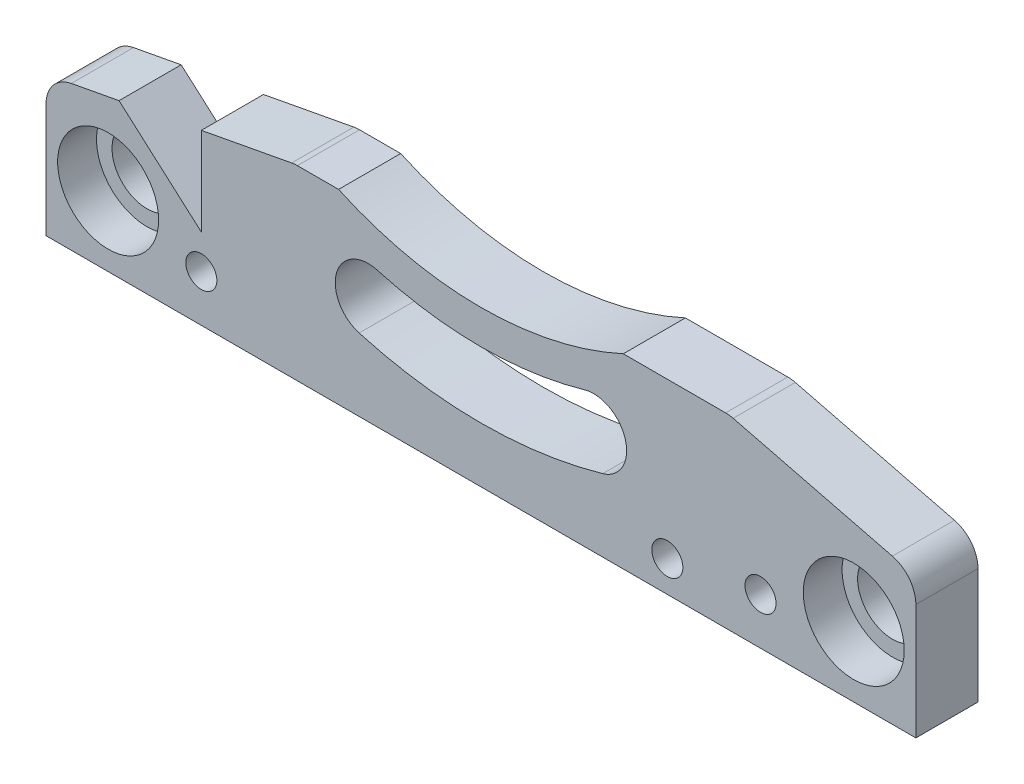
ISO-10303-21;
HEADER;
FILE_DESCRIPTION(('STEP AP214'),'2;1');
FILE_NAME('part.step','',(''),(''),'','','');
FILE_SCHEMA(('AUTOMOTIVE_DESIGN { 1 0 10303 214 1 1 1 1 }'));
ENDSEC;
DATA;
#1=APPLICATION_CONTEXT('core data for automotive mechanical design processes');
#2=APPLICATION_PROTOCOL_DEFINITION('international standard','automotive_design',2000,#1);
#3=PRODUCT_CONTEXT('',#1,'mechanical');
#4=PRODUCT('Part','Part','',(#3));
#5=PRODUCT_RELATED_PRODUCT_CATEGORY('part','',(#4));
#6=PRODUCT_DEFINITION_FORMATION('','',#4);
#7=PRODUCT_DEFINITION_CONTEXT('part definition',#1,'design');
#8=PRODUCT_DEFINITION('design','',#6,#7);
#9=PRODUCT_DEFINITION_SHAPE('','',#8);
#10=(LENGTH_UNIT() NAMED_UNIT(*) SI_UNIT(.MILLI.,.METRE.));
#11=(NAMED_UNIT(*) PLANE_ANGLE_UNIT() SI_UNIT($,.RADIAN.));
#12=(NAMED_UNIT(*) SI_UNIT($,.STERADIAN.) SOLID_ANGLE_UNIT());
#13=UNCERTAINTY_MEASURE_WITH_UNIT(LENGTH_MEASURE(1.E-05),#10,'distance_accuracy_value','');
#14=(GEOMETRIC_REPRESENTATION_CONTEXT(3) GLOBAL_UNCERTAINTY_ASSIGNED_CONTEXT((#13)) GLOBAL_UNIT_ASSIGNED_CONTEXT((#10,
#11,#12)) REPRESENTATION_CONTEXT('',''));
#15=CARTESIAN_POINT('',(0.,0.,0.));
#16=DIRECTION('',(0.,0.,1.));
#17=DIRECTION('',(1.,0.,0.));
#18=AXIS2_PLACEMENT_3D('',#15,#16,#17);
#19=CARTESIAN_POINT('',(-44.45,19.05,0.));
#20=DIRECTION('',(0.,0.,1.));
#21=DIRECTION('',(1.,0.,0.));
#22=AXIS2_PLACEMENT_3D('',#19,#20,#21);
#23=PLANE('',#22);
#24=CARTESIAN_POINT('',(-28.575,4.7625,0.));
#25=DIRECTION('',(0.,0.,1.));
#26=DIRECTION('',(1.,0.,0.));
#27=AXIS2_PLACEMENT_3D('',#24,#25,#26);
#28=CIRCLE('',#27,1.5875);
#29=CARTESIAN_POINT('',(-26.9875,4.7625,0.));
#30=VERTEX_POINT('',#29);
#31=EDGE_CURVE('E574',#30,#30,#28,.T.);
#32=ORIENTED_EDGE('',*,*,#31,.T.);
#33=EDGE_LOOP('',(#32));
#34=FACE_BOUND('',#33,.T.);
#35=CARTESIAN_POINT('',(19.05,3.17500000000001,0.));
#36=DIRECTION('',(0.,0.,1.));
#37=DIRECTION('',(1.,0.,0.));
#38=AXIS2_PLACEMENT_3D('',#35,#36,#37);
#39=CIRCLE('',#38,1.5875);
#40=CARTESIAN_POINT('',(20.6375,3.17500000000001,0.));
#41=VERTEX_POINT('',#40);
#42=EDGE_CURVE('E581',#41,#41,#39,.T.);
#43=ORIENTED_EDGE('',*,*,#42,.T.);
#44=EDGE_LOOP('',(#43));
#45=FACE_BOUND('',#44,.T.);
#46=CARTESIAN_POINT('',(28.575,4.7625,0.));
#47=DIRECTION('',(0.,0.,1.));
#48=DIRECTION('',(1.,0.,0.));
#49=AXIS2_PLACEMENT_3D('',#46,#47,#48);
#50=CIRCLE('',#49,1.5875);
#51=CARTESIAN_POINT('',(30.1625,4.7625,0.));
#52=VERTEX_POINT('',#51);
#53=EDGE_CURVE('E588',#52,#52,#50,.T.);
#54=ORIENTED_EDGE('',*,*,#53,.T.);
#55=EDGE_LOOP('',(#54));
#56=FACE_BOUND('',#55,.T.);
#57=CARTESIAN_POINT('',(-38.1,7.14375,0.));
#58=DIRECTION('',(0.,0.,1.));
#59=DIRECTION('',(1.,0.,0.));
#60=AXIS2_PLACEMENT_3D('',#57,#58,#59);
#61=CIRCLE('',#60,3.57187500000001);
#62=CARTESIAN_POINT('',(-34.528125,7.14375,0.));
#63=VERTEX_POINT('',#62);
#64=EDGE_CURVE('E602',#63,#63,#61,.T.);
#65=ORIENTED_EDGE('',*,*,#64,.T.);
#66=EDGE_LOOP('',(#65));
#67=FACE_BOUND('',#66,.T.);
#68=CARTESIAN_POINT('',(-11.5169556381017,10.6356025586092,0.));
#69=DIRECTION('',(0.,0.,-1.));
#70=DIRECTION('',(-1.,0.,0.));
#71=AXIS2_PLACEMENT_3D('',#68,#69,#70);
#72=CIRCLE('',#71,3.3734375);
#73=CARTESIAN_POINT('',(-12.4468010306156,7.39284630621731,0.));
#74=VERTEX_POINT('',#73);
#75=CARTESIAN_POINT('',(-10.5871102455878,13.8783588110011,0.));
#76=VERTEX_POINT('',#75);
#77=EDGE_CURVE('E164',#74,#76,#72,.T.);
#78=ORIENTED_EDGE('',*,*,#77,.F.);
#79=CARTESIAN_POINT('',(0.,50.8,0.));
#80=DIRECTION('',(0.,0.,-1.));
#81=DIRECTION('',(-1.,0.,0.));
#82=AXIS2_PLACEMENT_3D('',#79,#80,#81);
#83=CIRCLE('',#82,45.1564375);
#84=CARTESIAN_POINT('',(12.4468010306156,7.39284630621731,0.));
#85=VERTEX_POINT('',#84);
#86=EDGE_CURVE('E189',#85,#74,#83,.T.);
#87=ORIENTED_EDGE('',*,*,#86,.F.);
#88=CARTESIAN_POINT('',(11.5169556381017,10.6356025586092,0.));
#89=DIRECTION('',(0.,0.,-1.));
#90=DIRECTION('',(-1.,0.,0.));
#91=AXIS2_PLACEMENT_3D('',#88,#89,#90);
#92=CIRCLE('',#91,3.3734375);
#93=CARTESIAN_POINT('',(10.5871102455878,13.8783588110011,0.));
#94=VERTEX_POINT('',#93);
#95=EDGE_CURVE('E187',#94,#85,#92,.T.);
#96=ORIENTED_EDGE('',*,*,#95,.F.);
#97=CARTESIAN_POINT('',(0.,50.8,0.));
#98=DIRECTION('',(0.,0.,1.));
#99=DIRECTION('',(1.,0.,0.));
#100=AXIS2_PLACEMENT_3D('',#97,#98,#99);
#101=CIRCLE('',#100,38.4095625);
#102=EDGE_CURVE('E174',#76,#94,#101,.T.);
#103=ORIENTED_EDGE('',*,*,#102,.F.);
#104=EDGE_LOOP('',(#78,#87,#96,#103));
#105=FACE_BOUND('',#104,.T.);
#106=DIRECTION('',(-0.970142500145332,0.242535625036333,0.));
#107=VECTOR('',#106,1.);
#108=CARTESIAN_POINT('',(44.45,14.2875,0.));
#109=LINE('',#108,#107);
#110=CARTESIAN_POINT('',(42.0450506094903,14.8887373476274,0.));
#111=VERTEX_POINT('',#110);
#112=CARTESIAN_POINT('',(25.7791902481543,18.9552024379614,0.));
#113=VERTEX_POINT('',#112);
#114=EDGE_CURVE('E241',#111,#113,#109,.T.);
#115=ORIENTED_EDGE('',*,*,#114,.F.);
#116=CARTESIAN_POINT('',(41.275,11.808534909666,0.));
#117=DIRECTION('',(0.,0.,1.));
#118=DIRECTION('',(1.,0.,0.));
#119=AXIS2_PLACEMENT_3D('',#116,#117,#118);
#120=CIRCLE('',#119,3.175);
#121=CARTESIAN_POINT('',(44.45,11.808534909666,0.));
#122=VERTEX_POINT('',#121);
#123=EDGE_CURVE('E297',#111,#122,#120,.F.);
#124=ORIENTED_EDGE('',*,*,#123,.T.);
#125=DIRECTION('',(0.,1.,0.));
#126=VECTOR('',#125,1.);
#127=CARTESIAN_POINT('',(44.45,0.,0.));
#128=LINE('',#127,#126);
#129=CARTESIAN_POINT('',(44.45,0.,0.));
#130=VERTEX_POINT('',#129);
#131=EDGE_CURVE('E262',#130,#122,#128,.T.);
#132=ORIENTED_EDGE('',*,*,#131,.F.);
#133=DIRECTION('',(-1.,0.,0.));
#134=VECTOR('',#133,1.);
#135=CARTESIAN_POINT('',(44.45,0.,0.));
#136=LINE('',#135,#134);
#137=CARTESIAN_POINT('',(-44.45,0.,0.));
#138=VERTEX_POINT('',#137);
#139=EDGE_CURVE('E265',#130,#138,#136,.T.);
#140=ORIENTED_EDGE('',*,*,#139,.T.);
#141=DIRECTION('',(0.,1.,0.));
#142=VECTOR('',#141,1.);
#143=CARTESIAN_POINT('',(-44.45,0.,0.));
#144=LINE('',#143,#142);
#145=CARTESIAN_POINT('',(-44.45,11.6524840379615,0.));
#146=VERTEX_POINT('',#145);
#147=EDGE_CURVE('E268',#138,#146,#144,.T.);
#148=ORIENTED_EDGE('',*,*,#147,.T.);
#149=CARTESIAN_POINT('',(-41.275,11.6524840379615,0.));
#150=DIRECTION('',(0.,0.,1.));
#151=DIRECTION('',(1.,0.,0.));
#152=AXIS2_PLACEMENT_3D('',#149,#150,#151);
#153=CIRCLE('',#152,3.175);
#154=CARTESIAN_POINT('',(-41.8601160987843,14.7731032314779,0.));
#155=VERTEX_POINT('',#154);
#156=EDGE_CURVE('E47',#146,#155,#153,.F.);
#157=ORIENTED_EDGE('',*,*,#156,.T.);
#158=DIRECTION('',(-0.982872186934322,-0.184288535050185,0.));
#159=VECTOR('',#158,1.);
#160=CARTESIAN_POINT('',(-43.587358490566,14.4492452830189,0.));
#161=LINE('',#160,#159);
#162=CARTESIAN_POINT('',(-36.9843867316346,15.6873024878185,0.));
#163=VERTEX_POINT('',#162);
#164=EDGE_CURVE('E228',#163,#155,#161,.T.);
#165=ORIENTED_EDGE('',*,*,#164,.F.);
#166=DIRECTION('',(0.749616947953284,-0.661871914603727,0.));
#167=VECTOR('',#166,1.);
#168=CARTESIAN_POINT('',(-36.9843867316346,15.6873024878185,0.));
#169=LINE('',#168,#167);
#170=CARTESIAN_POINT('',(-28.575,8.26226105578167,0.));
#171=VERTEX_POINT('',#170);
#172=EDGE_CURVE('E210',#163,#171,#169,.T.);
#173=ORIENTED_EDGE('',*,*,#172,.T.);
#174=DIRECTION('',(0.,1.,0.));
#175=VECTOR('',#174,1.);
#176=CARTESIAN_POINT('',(-28.575,8.26226105578167,0.));
#177=LINE('',#176,#175);
#178=CARTESIAN_POINT('',(-28.575,17.2640625,0.));
#179=VERTEX_POINT('',#178);
#180=EDGE_CURVE('E207',#171,#179,#177,.T.);
#181=ORIENTED_EDGE('',*,*,#180,.T.);
#182=CARTESIAN_POINT('',(-19.3400309679121,18.9956191935165,0.));
#183=VERTEX_POINT('',#182);
#184=EDGE_CURVE('E229',#183,#179,#161,.T.);
#185=ORIENTED_EDGE('',*,*,#184,.F.);
#186=CARTESIAN_POINT('',(-18.7549148691278,15.875,0.));
#187=DIRECTION('',(0.,0.,1.));
#188=DIRECTION('',(1.,0.,0.));
#189=AXIS2_PLACEMENT_3D('',#186,#187,#188);
#190=CIRCLE('',#189,3.175);
#191=CARTESIAN_POINT('',(-18.7549148691278,19.05,0.));
#192=VERTEX_POINT('',#191);
#193=EDGE_CURVE('E294',#183,#192,#190,.F.);
#194=ORIENTED_EDGE('',*,*,#193,.T.);
#195=DIRECTION('',(1.,0.,0.));
#196=VECTOR('',#195,1.);
#197=CARTESIAN_POINT('',(-44.45,19.05,0.));
#198=LINE('',#197,#196);
#199=CARTESIAN_POINT('',(-14.5496778314848,19.05,0.));
#200=VERTEX_POINT('',#199);
#201=EDGE_CURVE('E260',#192,#200,#198,.T.);
#202=ORIENTED_EDGE('',*,*,#201,.T.);
#203=CARTESIAN_POINT('',(0.,50.8,0.));
#204=DIRECTION('',(0.,0.,1.));
#205=DIRECTION('',(1.,0.,0.));
#206=AXIS2_PLACEMENT_3D('',#203,#204,#205);
#207=CIRCLE('',#206,34.925);
#208=CARTESIAN_POINT('',(14.5496778314848,19.05,0.));
#209=VERTEX_POINT('',#208);
#210=EDGE_CURVE('E272',#209,#200,#207,.F.);
#211=ORIENTED_EDGE('',*,*,#210,.F.);
#212=CARTESIAN_POINT('',(25.0091396386639,19.05,0.));
#213=VERTEX_POINT('',#212);
#214=EDGE_CURVE('E244',#209,#213,#198,.T.);
#215=ORIENTED_EDGE('',*,*,#214,.T.);
#216=CARTESIAN_POINT('',(25.0091396386639,15.875,0.));
#217=DIRECTION('',(0.,0.,1.));
#218=DIRECTION('',(1.,0.,0.));
#219=AXIS2_PLACEMENT_3D('',#216,#217,#218);
#220=CIRCLE('',#219,3.175);
#221=EDGE_CURVE('E292',#213,#113,#220,.F.);
#222=ORIENTED_EDGE('',*,*,#221,.T.);
#223=EDGE_LOOP('',(#115,#124,#132,#140,#148,#157,#165,#173,#181,#185,#194,#202,#211,#215,#222));
#224=FACE_BOUND('',#223,.T.);
#225=CARTESIAN_POINT('',(38.1,7.14375,0.));
#226=DIRECTION('',(0.,0.,1.));
#227=DIRECTION('',(1.,0.,0.));
#228=AXIS2_PLACEMENT_3D('',#225,#226,#227);
#229=CIRCLE('',#228,3.57187500000001);
#230=CARTESIAN_POINT('',(41.671875,7.14375,0.));
#231=VERTEX_POINT('',#230);
#232=EDGE_CURVE('E196',#231,#231,#229,.T.);
#233=ORIENTED_EDGE('',*,*,#232,.T.);
#234=EDGE_LOOP('',(#233));
#235=FACE_BOUND('',#234,.T.);
#236=ADVANCED_FACE('F32',(#34,#45,#56,#67,#105,#224,#235),#23,.F.);
#237=CARTESIAN_POINT('',(-44.45,19.05,6.35));
#238=DIRECTION('',(0.,0.,1.));
#239=DIRECTION('',(1.,0.,0.));
#240=AXIS2_PLACEMENT_3D('',#237,#238,#239);
#241=PLANE('',#240);
#242=CARTESIAN_POINT('',(-28.575,4.7625,6.35));
#243=DIRECTION('',(0.,0.,1.));
#244=DIRECTION('',(1.,0.,0.));
#245=AXIS2_PLACEMENT_3D('',#242,#243,#244);
#246=CIRCLE('',#245,1.5875);
#247=CARTESIAN_POINT('',(-26.9875,4.7625,6.35));
#248=VERTEX_POINT('',#247);
#249=EDGE_CURVE('E577',#248,#248,#246,.T.);
#250=ORIENTED_EDGE('',*,*,#249,.F.);
#251=EDGE_LOOP('',(#250));
#252=FACE_BOUND('',#251,.T.);
#253=CARTESIAN_POINT('',(19.05,3.17500000000001,6.34999999994079));
#254=DIRECTION('',(0.,0.,1.));
#255=DIRECTION('',(1.,0.,0.));
#256=AXIS2_PLACEMENT_3D('',#253,#254,#255);
#257=CIRCLE('',#256,1.5875);
#258=CARTESIAN_POINT('',(20.6375,3.17500000000001,6.34999999994079));
#259=VERTEX_POINT('',#258);
#260=EDGE_CURVE('E578',#259,#259,#257,.T.);
#261=ORIENTED_EDGE('',*,*,#260,.F.);
#262=EDGE_LOOP('',(#261));
#263=FACE_BOUND('',#262,.T.);
#264=CARTESIAN_POINT('',(28.575,4.7625,6.35));
#265=DIRECTION('',(0.,0.,1.));
#266=DIRECTION('',(1.,0.,0.));
#267=AXIS2_PLACEMENT_3D('',#264,#265,#266);
#268=CIRCLE('',#267,1.5875);
#269=CARTESIAN_POINT('',(30.1625,4.7625,6.35));
#270=VERTEX_POINT('',#269);
#271=EDGE_CURVE('E586',#270,#270,#268,.T.);
#272=ORIENTED_EDGE('',*,*,#271,.F.);
#273=EDGE_LOOP('',(#272));
#274=FACE_BOUND('',#273,.T.);
#275=CARTESIAN_POINT('',(-38.1,7.14375,6.35));
#276=DIRECTION('',(0.,0.,1.));
#277=DIRECTION('',(1.,0.,0.));
#278=AXIS2_PLACEMENT_3D('',#275,#276,#277);
#279=CIRCLE('',#278,5.15937499999999);
#280=CARTESIAN_POINT('',(-32.940625,7.14375,6.35));
#281=VERTEX_POINT('',#280);
#282=EDGE_CURVE('E591',#281,#281,#279,.T.);
#283=ORIENTED_EDGE('',*,*,#282,.F.);
#284=EDGE_LOOP('',(#283));
#285=FACE_BOUND('',#284,.T.);
#286=CARTESIAN_POINT('',(0.,50.8,6.35));
#287=DIRECTION('',(0.,0.,-1.));
#288=DIRECTION('',(-1.,0.,0.));
#289=AXIS2_PLACEMENT_3D('',#286,#287,#288);
#290=CIRCLE('',#289,45.1564375);
#291=CARTESIAN_POINT('',(12.4468010306156,7.39284630621731,6.35));
#292=VERTEX_POINT('',#291);
#293=CARTESIAN_POINT('',(-12.4468010306156,7.39284630621731,6.35));
#294=VERTEX_POINT('',#293);
#295=EDGE_CURVE('E175',#292,#294,#290,.T.);
#296=ORIENTED_EDGE('',*,*,#295,.T.);
#297=CARTESIAN_POINT('',(-11.5169556381017,10.6356025586092,6.35));
#298=DIRECTION('',(0.,0.,-1.));
#299=DIRECTION('',(-1.,0.,0.));
#300=AXIS2_PLACEMENT_3D('',#297,#298,#299);
#301=CIRCLE('',#300,3.3734375);
#302=CARTESIAN_POINT('',(-10.5871102455878,13.8783588110011,6.35));
#303=VERTEX_POINT('',#302);
#304=EDGE_CURVE('E194',#294,#303,#301,.T.);
#305=ORIENTED_EDGE('',*,*,#304,.T.);
#306=CARTESIAN_POINT('',(0.,50.8,6.35));
#307=DIRECTION('',(0.,0.,1.));
#308=DIRECTION('',(1.,0.,0.));
#309=AXIS2_PLACEMENT_3D('',#306,#307,#308);
#310=CIRCLE('',#309,38.4095625);
#311=CARTESIAN_POINT('',(10.5871102455878,13.8783588110011,6.35));
#312=VERTEX_POINT('',#311);
#313=EDGE_CURVE('E181',#303,#312,#310,.T.);
#314=ORIENTED_EDGE('',*,*,#313,.T.);
#315=CARTESIAN_POINT('',(11.5169556381017,10.6356025586092,6.35));
#316=DIRECTION('',(0.,0.,-1.));
#317=DIRECTION('',(-1.,0.,0.));
#318=AXIS2_PLACEMENT_3D('',#315,#316,#317);
#319=CIRCLE('',#318,3.3734375);
#320=EDGE_CURVE('E198',#312,#292,#319,.T.);
#321=ORIENTED_EDGE('',*,*,#320,.T.);
#322=EDGE_LOOP('',(#296,#305,#314,#321));
#323=FACE_BOUND('',#322,.T.);
#324=DIRECTION('',(0.,1.,0.));
#325=VECTOR('',#324,1.);
#326=CARTESIAN_POINT('',(44.45,0.,6.35));
#327=LINE('',#326,#325);
#328=CARTESIAN_POINT('',(44.45,0.,6.35));
#329=VERTEX_POINT('',#328);
#330=CARTESIAN_POINT('',(44.45,11.808534909666,6.35));
#331=VERTEX_POINT('',#330);
#332=EDGE_CURVE('E249',#329,#331,#327,.T.);
#333=ORIENTED_EDGE('',*,*,#332,.T.);
#334=CARTESIAN_POINT('',(41.275,11.808534909666,6.35));
#335=DIRECTION('',(0.,0.,1.));
#336=DIRECTION('',(1.,0.,0.));
#337=AXIS2_PLACEMENT_3D('',#334,#335,#336);
#338=CIRCLE('',#337,3.175);
#339=CARTESIAN_POINT('',(42.0450506094903,14.8887373476274,6.35));
#340=VERTEX_POINT('',#339);
#341=EDGE_CURVE('E285',#331,#340,#338,.T.);
#342=ORIENTED_EDGE('',*,*,#341,.T.);
#343=DIRECTION('',(-0.970142500145332,0.242535625036333,0.));
#344=VECTOR('',#343,1.);
#345=CARTESIAN_POINT('',(44.45,14.2875,6.35));
#346=LINE('',#345,#344);
#347=CARTESIAN_POINT('',(25.7791902481543,18.9552024379614,6.35));
#348=VERTEX_POINT('',#347);
#349=EDGE_CURVE('E238',#340,#348,#346,.T.);
#350=ORIENTED_EDGE('',*,*,#349,.T.);
#351=CARTESIAN_POINT('',(25.0091396386639,15.875,6.35));
#352=DIRECTION('',(0.,0.,1.));
#353=DIRECTION('',(1.,0.,0.));
#354=AXIS2_PLACEMENT_3D('',#351,#352,#353);
#355=CIRCLE('',#354,3.175);
#356=CARTESIAN_POINT('',(25.0091396386639,19.05,6.35));
#357=VERTEX_POINT('',#356);
#358=EDGE_CURVE('E279',#348,#357,#355,.T.);
#359=ORIENTED_EDGE('',*,*,#358,.T.);
#360=DIRECTION('',(1.,0.,0.));
#361=VECTOR('',#360,1.);
#362=CARTESIAN_POINT('',(-44.45,19.05,6.35));
#363=LINE('',#362,#361);
#364=CARTESIAN_POINT('',(14.5496778314848,19.05,6.35));
#365=VERTEX_POINT('',#364);
#366=EDGE_CURVE('E250',#365,#357,#363,.T.);
#367=ORIENTED_EDGE('',*,*,#366,.F.);
#368=CARTESIAN_POINT('',(0.,50.8,6.35));
#369=DIRECTION('',(0.,0.,1.));
#370=DIRECTION('',(1.,0.,0.));
#371=AXIS2_PLACEMENT_3D('',#368,#369,#370);
#372=CIRCLE('',#371,34.925);
#373=CARTESIAN_POINT('',(-14.5496778314848,19.05,6.35));
#374=VERTEX_POINT('',#373);
#375=EDGE_CURVE('E232',#374,#365,#372,.T.);
#376=ORIENTED_EDGE('',*,*,#375,.F.);
#377=CARTESIAN_POINT('',(-18.7549148691278,19.05,6.35));
#378=VERTEX_POINT('',#377);
#379=EDGE_CURVE('E247',#378,#374,#363,.T.);
#380=ORIENTED_EDGE('',*,*,#379,.F.);
#381=CARTESIAN_POINT('',(-18.7549148691278,15.875,6.35));
#382=DIRECTION('',(0.,0.,1.));
#383=DIRECTION('',(1.,0.,0.));
#384=AXIS2_PLACEMENT_3D('',#381,#382,#383);
#385=CIRCLE('',#384,3.175);
#386=CARTESIAN_POINT('',(-19.3400309679121,18.9956191935165,6.35));
#387=VERTEX_POINT('',#386);
#388=EDGE_CURVE('E281',#378,#387,#385,.T.);
#389=ORIENTED_EDGE('',*,*,#388,.T.);
#390=DIRECTION('',(0.982872186934322,0.184288535050185,0.));
#391=VECTOR('',#390,1.);
#392=CARTESIAN_POINT('',(-44.45,14.2875,6.35));
#393=LINE('',#392,#391);
#394=CARTESIAN_POINT('',(-28.575,17.2640625,6.35));
#395=VERTEX_POINT('',#394);
#396=EDGE_CURVE('E225',#395,#387,#393,.T.);
#397=ORIENTED_EDGE('',*,*,#396,.F.);
#398=DIRECTION('',(0.,1.,0.));
#399=VECTOR('',#398,1.);
#400=CARTESIAN_POINT('',(-28.575,8.26226105578167,6.35));
#401=LINE('',#400,#399);
#402=CARTESIAN_POINT('',(-28.575,8.26226105578167,6.35));
#403=VERTEX_POINT('',#402);
#404=EDGE_CURVE('E182',#403,#395,#401,.T.);
#405=ORIENTED_EDGE('',*,*,#404,.F.);
#406=DIRECTION('',(0.749616947953284,-0.661871914603727,0.));
#407=VECTOR('',#406,1.);
#408=CARTESIAN_POINT('',(-36.9843867316346,15.6873024878185,6.35));
#409=LINE('',#408,#407);
#410=CARTESIAN_POINT('',(-36.9843867316346,15.6873024878185,6.35));
#411=VERTEX_POINT('',#410);
#412=EDGE_CURVE('E211',#411,#403,#409,.T.);
#413=ORIENTED_EDGE('',*,*,#412,.F.);
#414=CARTESIAN_POINT('',(-41.8601160987843,14.7731032314779,6.35));
#415=VERTEX_POINT('',#414);
#416=EDGE_CURVE('E226',#415,#411,#393,.T.);
#417=ORIENTED_EDGE('',*,*,#416,.F.);
#418=CARTESIAN_POINT('',(-41.275,11.6524840379615,6.35));
#419=DIRECTION('',(0.,0.,1.));
#420=DIRECTION('',(1.,0.,0.));
#421=AXIS2_PLACEMENT_3D('',#418,#419,#420);
#422=CIRCLE('',#421,3.175);
#423=CARTESIAN_POINT('',(-44.45,11.6524840379615,6.35));
#424=VERTEX_POINT('',#423);
#425=EDGE_CURVE('E283',#415,#424,#422,.T.);
#426=ORIENTED_EDGE('',*,*,#425,.T.);
#427=DIRECTION('',(0.,1.,0.));
#428=VECTOR('',#427,1.);
#429=CARTESIAN_POINT('',(-44.45,0.,6.35));
#430=LINE('',#429,#428);
#431=CARTESIAN_POINT('',(-44.45,0.,6.35));
#432=VERTEX_POINT('',#431);
#433=EDGE_CURVE('E256',#432,#424,#430,.T.);
#434=ORIENTED_EDGE('',*,*,#433,.F.);
#435=DIRECTION('',(-1.,0.,0.));
#436=VECTOR('',#435,1.);
#437=CARTESIAN_POINT('',(44.45,0.,6.35));
#438=LINE('',#437,#436);
#439=EDGE_CURVE('E253',#329,#432,#438,.T.);
#440=ORIENTED_EDGE('',*,*,#439,.F.);
#441=EDGE_LOOP('',(#333,#342,#350,#359,#367,#376,#380,#389,#397,#405,#413,#417,#426,#434,#440));
#442=FACE_BOUND('',#441,.T.);
#443=CARTESIAN_POINT('',(38.1,7.14375,6.35));
#444=DIRECTION('',(0.,0.,1.));
#445=DIRECTION('',(1.,0.,0.));
#446=AXIS2_PLACEMENT_3D('',#443,#444,#445);
#447=CIRCLE('',#446,5.15937499999999);
#448=CARTESIAN_POINT('',(43.259375,7.14375,6.35));
#449=VERTEX_POINT('',#448);
#450=EDGE_CURVE('E605',#449,#449,#447,.T.);
#451=ORIENTED_EDGE('',*,*,#450,.F.);
#452=EDGE_LOOP('',(#451));
#453=FACE_BOUND('',#452,.T.);
#454=ADVANCED_FACE('F314',(#252,#263,#274,#285,#323,#442,#453),#241,.T.);
#455=CARTESIAN_POINT('',(-44.45,14.2875,6.35));
#456=DIRECTION('',(-0.184288535050185,0.982872186934322,0.));
#457=DIRECTION('',(-0.982872186934322,-0.184288535050185,0.));
#458=AXIS2_PLACEMENT_3D('',#455,#456,#457);
#459=PLANE('',#458);
#460=ORIENTED_EDGE('',*,*,#396,.T.);
#461=DIRECTION('',(0.,0.,-1.));
#462=VECTOR('',#461,1.);
#463=CARTESIAN_POINT('',(-19.3400309679121,18.9956191935165,6.35));
#464=LINE('',#463,#462);
#465=EDGE_CURVE('E303',#387,#183,#464,.T.);
#466=ORIENTED_EDGE('',*,*,#465,.T.);
#467=ORIENTED_EDGE('',*,*,#184,.T.);
#468=DIRECTION('',(0.,0.,1.));
#469=VECTOR('',#468,1.);
#470=CARTESIAN_POINT('',(-28.575,17.2640625,0.));
#471=LINE('',#470,#469);
#472=EDGE_CURVE('E222',#179,#395,#471,.T.);
#473=ORIENTED_EDGE('',*,*,#472,.T.);
#474=EDGE_LOOP('',(#460,#466,#467,#473));
#475=FACE_BOUND('',#474,.T.);
#476=ADVANCED_FACE('F324',(#475),#459,.T.);
#477=CARTESIAN_POINT('',(-44.45,19.05,6.35));
#478=DIRECTION('',(0.,1.,0.));
#479=DIRECTION('',(-1.,0.,0.));
#480=AXIS2_PLACEMENT_3D('',#477,#478,#479);
#481=PLANE('',#480);
#482=ORIENTED_EDGE('',*,*,#201,.F.);
#483=DIRECTION('',(0.,0.,-1.));
#484=VECTOR('',#483,1.);
#485=CARTESIAN_POINT('',(-18.7549148691278,19.05,6.35));
#486=LINE('',#485,#484);
#487=EDGE_CURVE('E40',#192,#378,#486,.F.);
#488=ORIENTED_EDGE('',*,*,#487,.T.);
#489=ORIENTED_EDGE('',*,*,#379,.T.);
#490=DIRECTION('',(0.,0.,-1.));
#491=VECTOR('',#490,1.);
#492=CARTESIAN_POINT('',(-14.5496778314848,19.05,6.35));
#493=LINE('',#492,#491);
#494=EDGE_CURVE('E231',#374,#200,#493,.T.);
#495=ORIENTED_EDGE('',*,*,#494,.T.);
#496=EDGE_LOOP('',(#482,#488,#489,#495));
#497=FACE_BOUND('',#496,.T.);
#498=ADVANCED_FACE('F309',(#497),#481,.T.);
#499=CARTESIAN_POINT('',(-44.45,0.,6.35));
#500=DIRECTION('',(-1.,0.,0.));
#501=DIRECTION('',(0.,-1.,0.));
#502=AXIS2_PLACEMENT_3D('',#499,#500,#501);
#503=PLANE('',#502);
#504=ORIENTED_EDGE('',*,*,#433,.T.);
#505=DIRECTION('',(0.,0.,-1.));
#506=VECTOR('',#505,1.);
#507=CARTESIAN_POINT('',(-44.45,11.6524840379615,6.35));
#508=LINE('',#507,#506);
#509=EDGE_CURVE('E299',#424,#146,#508,.T.);
#510=ORIENTED_EDGE('',*,*,#509,.T.);
#511=ORIENTED_EDGE('',*,*,#147,.F.);
#512=DIRECTION('',(0.,0.,-1.));
#513=VECTOR('',#512,1.);
#514=CARTESIAN_POINT('',(-44.45,0.,6.35));
#515=LINE('',#514,#513);
#516=EDGE_CURVE('E270',#432,#138,#515,.T.);
#517=ORIENTED_EDGE('',*,*,#516,.F.);
#518=EDGE_LOOP('',(#504,#510,#511,#517));
#519=FACE_BOUND('',#518,.T.);
#520=ADVANCED_FACE('F344',(#519),#503,.T.);
#521=ORIENTED_EDGE('',*,*,#366,.T.);
#522=DIRECTION('',(0.,0.,1.));
#523=VECTOR('',#522,1.);
#524=CARTESIAN_POINT('',(25.0091396386639,19.05,6.35));
#525=LINE('',#524,#523);
#526=EDGE_CURVE('E11',#357,#213,#525,.F.);
#527=ORIENTED_EDGE('',*,*,#526,.T.);
#528=ORIENTED_EDGE('',*,*,#214,.F.);
#529=DIRECTION('',(0.,0.,-1.));
#530=VECTOR('',#529,1.);
#531=CARTESIAN_POINT('',(14.5496778314848,19.05,6.35));
#532=LINE('',#531,#530);
#533=EDGE_CURVE('E235',#365,#209,#532,.T.);
#534=ORIENTED_EDGE('',*,*,#533,.F.);
#535=EDGE_LOOP('',(#521,#527,#528,#534));
#536=FACE_BOUND('',#535,.T.);
#537=ADVANCED_FACE('F369',(#536),#481,.T.);
#538=CARTESIAN_POINT('',(44.45,0.,6.35));
#539=DIRECTION('',(-1.,0.,0.));
#540=DIRECTION('',(0.,-1.,0.));
#541=AXIS2_PLACEMENT_3D('',#538,#539,#540);
#542=PLANE('',#541);
#543=ORIENTED_EDGE('',*,*,#131,.T.);
#544=DIRECTION('',(0.,0.,1.));
#545=VECTOR('',#544,1.);
#546=CARTESIAN_POINT('',(44.45,11.808534909666,6.35));
#547=LINE('',#546,#545);
#548=EDGE_CURVE('E276',#122,#331,#547,.T.);
#549=ORIENTED_EDGE('',*,*,#548,.T.);
#550=ORIENTED_EDGE('',*,*,#332,.F.);
#551=DIRECTION('',(0.,0.,-1.));
#552=VECTOR('',#551,1.);
#553=CARTESIAN_POINT('',(44.45,0.,6.35));
#554=LINE('',#553,#552);
#555=EDGE_CURVE('E259',#329,#130,#554,.T.);
#556=ORIENTED_EDGE('',*,*,#555,.T.);
#557=EDGE_LOOP('',(#543,#549,#550,#556));
#558=FACE_BOUND('',#557,.T.);
#559=ADVANCED_FACE('F352',(#558),#542,.F.);
#560=CARTESIAN_POINT('',(44.45,0.,6.35));
#561=DIRECTION('',(0.,-1.,0.));
#562=DIRECTION('',(1.,0.,0.));
#563=AXIS2_PLACEMENT_3D('',#560,#561,#562);
#564=PLANE('',#563);
#565=ORIENTED_EDGE('',*,*,#139,.F.);
#566=ORIENTED_EDGE('',*,*,#555,.F.);
#567=ORIENTED_EDGE('',*,*,#439,.T.);
#568=ORIENTED_EDGE('',*,*,#516,.T.);
#569=EDGE_LOOP('',(#565,#566,#567,#568));
#570=FACE_BOUND('',#569,.T.);
#571=ADVANCED_FACE('F348',(#570),#564,.T.);
#572=CARTESIAN_POINT('',(44.45,14.2875,0.));
#573=DIRECTION('',(0.242535625036333,0.970142500145332,0.));
#574=DIRECTION('',(-0.970142500145332,0.242535625036333,0.));
#575=AXIS2_PLACEMENT_3D('',#572,#573,#574);
#576=PLANE('',#575);
#577=ORIENTED_EDGE('',*,*,#349,.F.);
#578=DIRECTION('',(0.,0.,1.));
#579=VECTOR('',#578,1.);
#580=CARTESIAN_POINT('',(42.0450506094903,14.8887373476274,0.));
#581=LINE('',#580,#579);
#582=EDGE_CURVE('E290',#340,#111,#581,.F.);
#583=ORIENTED_EDGE('',*,*,#582,.T.);
#584=ORIENTED_EDGE('',*,*,#114,.T.);
#585=DIRECTION('',(0.,0.,1.));
#586=VECTOR('',#585,1.);
#587=CARTESIAN_POINT('',(25.7791902481543,18.9552024379614,0.));
#588=LINE('',#587,#586);
#589=EDGE_CURVE('E287',#113,#348,#588,.T.);
#590=ORIENTED_EDGE('',*,*,#589,.T.);
#591=EDGE_LOOP('',(#577,#583,#584,#590));
#592=FACE_BOUND('',#591,.T.);
#593=ADVANCED_FACE('F360',(#592),#576,.T.);
#594=CARTESIAN_POINT('',(0.,50.8,6.35));
#595=DIRECTION('',(0.,0.,-1.));
#596=DIRECTION('',(-1.,0.,0.));
#597=AXIS2_PLACEMENT_3D('',#594,#595,#596);
#598=CYLINDRICAL_SURFACE('',#597,34.925);
#599=ORIENTED_EDGE('',*,*,#533,.T.);
#600=ORIENTED_EDGE('',*,*,#210,.T.);
#601=ORIENTED_EDGE('',*,*,#494,.F.);
#602=ORIENTED_EDGE('',*,*,#375,.T.);
#603=EDGE_LOOP('',(#599,#600,#601,#602));
#604=FACE_BOUND('',#603,.T.);
#605=ADVANCED_FACE('F371',(#604),#598,.F.);
#606=ORIENTED_EDGE('',*,*,#164,.T.);
#607=DIRECTION('',(0.,0.,-1.));
#608=VECTOR('',#607,1.);
#609=CARTESIAN_POINT('',(-41.8601160987843,14.7731032314779,6.35));
#610=LINE('',#609,#608);
#611=EDGE_CURVE('E301',#155,#415,#610,.F.);
#612=ORIENTED_EDGE('',*,*,#611,.T.);
#613=ORIENTED_EDGE('',*,*,#416,.T.);
#614=DIRECTION('',(0.,0.,1.));
#615=VECTOR('',#614,1.);
#616=CARTESIAN_POINT('',(-36.9843867316346,15.6873024878185,0.));
#617=LINE('',#616,#615);
#618=EDGE_CURVE('E214',#163,#411,#617,.T.);
#619=ORIENTED_EDGE('',*,*,#618,.F.);
#620=EDGE_LOOP('',(#606,#612,#613,#619));
#621=FACE_BOUND('',#620,.T.);
#622=ADVANCED_FACE('F339',(#621),#459,.T.);
#623=CARTESIAN_POINT('',(-28.575,8.26226105578167,0.));
#624=DIRECTION('',(1.,0.,0.));
#625=DIRECTION('',(0.,0.,-1.));
#626=AXIS2_PLACEMENT_3D('',#623,#624,#625);
#627=PLANE('',#626);
#628=ORIENTED_EDGE('',*,*,#404,.T.);
#629=ORIENTED_EDGE('',*,*,#472,.F.);
#630=ORIENTED_EDGE('',*,*,#180,.F.);
#631=DIRECTION('',(0.,0.,1.));
#632=VECTOR('',#631,1.);
#633=CARTESIAN_POINT('',(-28.575,8.26226105578167,0.));
#634=LINE('',#633,#632);
#635=EDGE_CURVE('E220',#171,#403,#634,.T.);
#636=ORIENTED_EDGE('',*,*,#635,.T.);
#637=EDGE_LOOP('',(#628,#629,#630,#636));
#638=FACE_BOUND('',#637,.T.);
#639=ADVANCED_FACE('F330',(#638),#627,.F.);
#640=CARTESIAN_POINT('',(-36.9843867316346,15.6873024878185,0.));
#641=DIRECTION('',(-0.661871914603727,-0.749616947953284,0.));
#642=DIRECTION('',(0.749616947953284,-0.661871914603727,0.));
#643=AXIS2_PLACEMENT_3D('',#640,#641,#642);
#644=PLANE('',#643);
#645=ORIENTED_EDGE('',*,*,#412,.T.);
#646=ORIENTED_EDGE('',*,*,#635,.F.);
#647=ORIENTED_EDGE('',*,*,#172,.F.);
#648=ORIENTED_EDGE('',*,*,#618,.T.);
#649=EDGE_LOOP('',(#645,#646,#647,#648));
#650=FACE_BOUND('',#649,.T.);
#651=ADVANCED_FACE('F336',(#650),#644,.F.);
#652=CARTESIAN_POINT('',(-11.5169556381017,10.6356025586092,0.));
#653=DIRECTION('',(0.,0.,1.));
#654=DIRECTION('',(1.,0.,0.));
#655=AXIS2_PLACEMENT_3D('',#652,#653,#654);
#656=CYLINDRICAL_SURFACE('',#655,3.3734375);
#657=ORIENTED_EDGE('',*,*,#304,.F.);
#658=DIRECTION('',(0.,0.,1.));
#659=VECTOR('',#658,1.);
#660=CARTESIAN_POINT('',(-12.4468010306156,7.39284630621731,0.));
#661=LINE('',#660,#659);
#662=EDGE_CURVE('E170',#74,#294,#661,.T.);
#663=ORIENTED_EDGE('',*,*,#662,.F.);
#664=ORIENTED_EDGE('',*,*,#77,.T.);
#665=DIRECTION('',(0.,0.,1.));
#666=VECTOR('',#665,1.);
#667=CARTESIAN_POINT('',(-10.5871102455878,13.8783588110011,0.));
#668=LINE('',#667,#666);
#669=EDGE_CURVE('E167',#76,#303,#668,.T.);
#670=ORIENTED_EDGE('',*,*,#669,.T.);
#671=EDGE_LOOP('',(#657,#663,#664,#670));
#672=FACE_BOUND('',#671,.T.);
#673=ADVANCED_FACE('F166',(#672),#656,.F.);
#674=CARTESIAN_POINT('',(0.,50.8,0.));
#675=DIRECTION('',(0.,0.,1.));
#676=DIRECTION('',(1.,0.,0.));
#677=AXIS2_PLACEMENT_3D('',#674,#675,#676);
#678=CYLINDRICAL_SURFACE('',#677,38.4095625);
#679=ORIENTED_EDGE('',*,*,#313,.F.);
#680=ORIENTED_EDGE('',*,*,#669,.F.);
#681=ORIENTED_EDGE('',*,*,#102,.T.);
#682=DIRECTION('',(0.,0.,1.));
#683=VECTOR('',#682,1.);
#684=CARTESIAN_POINT('',(10.5871102455878,13.8783588110011,0.));
#685=LINE('',#684,#683);
#686=EDGE_CURVE('E183',#94,#312,#685,.T.);
#687=ORIENTED_EDGE('',*,*,#686,.T.);
#688=EDGE_LOOP('',(#679,#680,#681,#687));
#689=FACE_BOUND('',#688,.T.);
#690=ADVANCED_FACE('F178',(#689),#678,.T.);
#691=CARTESIAN_POINT('',(11.5169556381017,10.6356025586092,0.));
#692=DIRECTION('',(0.,0.,1.));
#693=DIRECTION('',(1.,0.,0.));
#694=AXIS2_PLACEMENT_3D('',#691,#692,#693);
#695=CYLINDRICAL_SURFACE('',#694,3.3734375);
#696=ORIENTED_EDGE('',*,*,#320,.F.);
#697=ORIENTED_EDGE('',*,*,#686,.F.);
#698=ORIENTED_EDGE('',*,*,#95,.T.);
#699=DIRECTION('',(0.,0.,1.));
#700=VECTOR('',#699,1.);
#701=CARTESIAN_POINT('',(12.4468010306156,7.39284630621731,0.));
#702=LINE('',#701,#700);
#703=EDGE_CURVE('E204',#85,#292,#702,.T.);
#704=ORIENTED_EDGE('',*,*,#703,.T.);
#705=EDGE_LOOP('',(#696,#697,#698,#704));
#706=FACE_BOUND('',#705,.T.);
#707=ADVANCED_FACE('F426',(#706),#695,.F.);
#708=CARTESIAN_POINT('',(0.,50.8,0.));
#709=DIRECTION('',(0.,0.,1.));
#710=DIRECTION('',(1.,0.,0.));
#711=AXIS2_PLACEMENT_3D('',#708,#709,#710);
#712=CYLINDRICAL_SURFACE('',#711,45.1564375);
#713=ORIENTED_EDGE('',*,*,#295,.F.);
#714=ORIENTED_EDGE('',*,*,#703,.F.);
#715=ORIENTED_EDGE('',*,*,#86,.T.);
#716=ORIENTED_EDGE('',*,*,#662,.T.);
#717=EDGE_LOOP('',(#713,#714,#715,#716));
#718=FACE_BOUND('',#717,.T.);
#719=ADVANCED_FACE('F401',(#718),#712,.F.);
#720=CARTESIAN_POINT('',(41.275,11.808534909666,6.35));
#721=DIRECTION('',(0.,0.,-1.));
#722=DIRECTION('',(-1.,0.,0.));
#723=AXIS2_PLACEMENT_3D('',#720,#721,#722);
#724=CYLINDRICAL_SURFACE('',#723,3.175);
#725=ORIENTED_EDGE('',*,*,#123,.F.);
#726=ORIENTED_EDGE('',*,*,#582,.F.);
#727=ORIENTED_EDGE('',*,*,#341,.F.);
#728=ORIENTED_EDGE('',*,*,#548,.F.);
#729=EDGE_LOOP('',(#725,#726,#727,#728));
#730=FACE_BOUND('',#729,.T.);
#731=ADVANCED_FACE('F357',(#730),#724,.T.);
#732=CARTESIAN_POINT('',(-41.275,11.6524840379615,6.35));
#733=DIRECTION('',(0.,0.,-1.));
#734=DIRECTION('',(-1.,0.,0.));
#735=AXIS2_PLACEMENT_3D('',#732,#733,#734);
#736=CYLINDRICAL_SURFACE('',#735,3.175);
#737=ORIENTED_EDGE('',*,*,#425,.F.);
#738=ORIENTED_EDGE('',*,*,#611,.F.);
#739=ORIENTED_EDGE('',*,*,#156,.F.);
#740=ORIENTED_EDGE('',*,*,#509,.F.);
#741=EDGE_LOOP('',(#737,#738,#739,#740));
#742=FACE_BOUND('',#741,.T.);
#743=ADVANCED_FACE('F340',(#742),#736,.T.);
#744=CARTESIAN_POINT('',(-18.7549148691278,15.875,6.35));
#745=DIRECTION('',(0.,0.,-1.));
#746=DIRECTION('',(-1.,0.,0.));
#747=AXIS2_PLACEMENT_3D('',#744,#745,#746);
#748=CYLINDRICAL_SURFACE('',#747,3.175);
#749=ORIENTED_EDGE('',*,*,#388,.F.);
#750=ORIENTED_EDGE('',*,*,#487,.F.);
#751=ORIENTED_EDGE('',*,*,#193,.F.);
#752=ORIENTED_EDGE('',*,*,#465,.F.);
#753=EDGE_LOOP('',(#749,#750,#751,#752));
#754=FACE_BOUND('',#753,.T.);
#755=ADVANCED_FACE('F321',(#754),#748,.T.);
#756=CARTESIAN_POINT('',(25.0091396386639,15.875,0.));
#757=DIRECTION('',(0.,0.,1.));
#758=DIRECTION('',(1.,0.,0.));
#759=AXIS2_PLACEMENT_3D('',#756,#757,#758);
#760=CYLINDRICAL_SURFACE('',#759,3.175);
#761=ORIENTED_EDGE('',*,*,#221,.F.);
#762=ORIENTED_EDGE('',*,*,#526,.F.);
#763=ORIENTED_EDGE('',*,*,#358,.F.);
#764=ORIENTED_EDGE('',*,*,#589,.F.);
#765=EDGE_LOOP('',(#761,#762,#763,#764));
#766=FACE_BOUND('',#765,.T.);
#767=ADVANCED_FACE('F34',(#766),#760,.T.);
#768=CARTESIAN_POINT('',(38.1,7.14375,6.35));
#769=DIRECTION('',(0.,0.,1.));
#770=DIRECTION('',(1.,0.,0.));
#771=AXIS2_PLACEMENT_3D('',#768,#769,#770);
#772=CYLINDRICAL_SURFACE('',#771,3.571875);
#773=CARTESIAN_POINT('',(38.1,7.14375,2.38125));
#774=DIRECTION('',(0.,0.,1.));
#775=DIRECTION('',(1.,0.,0.));
#776=AXIS2_PLACEMENT_3D('',#773,#774,#775);
#777=CIRCLE('',#776,3.57187499999999);
#778=CARTESIAN_POINT('',(41.671875,7.14375,2.38125));
#779=VERTEX_POINT('',#778);
#780=EDGE_CURVE('E611',#779,#779,#777,.T.);
#781=ORIENTED_EDGE('',*,*,#780,.T.);
#782=EDGE_LOOP('',(#781));
#783=FACE_BOUND('',#782,.T.);
#784=ORIENTED_EDGE('',*,*,#232,.F.);
#785=EDGE_LOOP('',(#784));
#786=FACE_BOUND('',#785,.T.);
#787=ADVANCED_FACE('F407',(#783,#786),#772,.F.);
#788=CARTESIAN_POINT('',(41.671875,7.14375,2.38125));
#789=DIRECTION('',(0.,0.,1.));
#790=DIRECTION('',(1.,0.,0.));
#791=AXIS2_PLACEMENT_3D('',#788,#789,#790);
#792=PLANE('',#791);
#793=CARTESIAN_POINT('',(38.1,7.14375,2.38125));
#794=DIRECTION('',(0.,0.,1.));
#795=DIRECTION('',(1.,0.,0.));
#796=AXIS2_PLACEMENT_3D('',#793,#794,#795);
#797=CIRCLE('',#796,5.15937499999999);
#798=CARTESIAN_POINT('',(43.259375,7.14375,2.38125));
#799=VERTEX_POINT('',#798);
#800=EDGE_CURVE('E608',#799,#799,#797,.T.);
#801=ORIENTED_EDGE('',*,*,#800,.T.);
#802=EDGE_LOOP('',(#801));
#803=FACE_BOUND('',#802,.T.);
#804=ORIENTED_EDGE('',*,*,#780,.F.);
#805=EDGE_LOOP('',(#804));
#806=FACE_BOUND('',#805,.T.);
#807=ADVANCED_FACE('F411',(#803,#806),#792,.T.);
#808=CARTESIAN_POINT('',(38.1,7.14375,6.35));
#809=DIRECTION('',(0.,0.,1.));
#810=DIRECTION('',(1.,0.,0.));
#811=AXIS2_PLACEMENT_3D('',#808,#809,#810);
#812=CYLINDRICAL_SURFACE('',#811,5.15937499999999);
#813=ORIENTED_EDGE('',*,*,#450,.T.);
#814=EDGE_LOOP('',(#813));
#815=FACE_BOUND('',#814,.T.);
#816=ORIENTED_EDGE('',*,*,#800,.F.);
#817=EDGE_LOOP('',(#816));
#818=FACE_BOUND('',#817,.T.);
#819=ADVANCED_FACE('F417',(#815,#818),#812,.F.);
#820=CARTESIAN_POINT('',(-38.1,7.14375,6.35));
#821=DIRECTION('',(0.,0.,1.));
#822=DIRECTION('',(1.,0.,0.));
#823=AXIS2_PLACEMENT_3D('',#820,#821,#822);
#824=CYLINDRICAL_SURFACE('',#823,3.571875);
#825=CARTESIAN_POINT('',(-38.1,7.14375,2.38125));
#826=DIRECTION('',(0.,0.,1.));
#827=DIRECTION('',(1.,0.,0.));
#828=AXIS2_PLACEMENT_3D('',#825,#826,#827);
#829=CIRCLE('',#828,3.57187499999999);
#830=CARTESIAN_POINT('',(-34.528125,7.14375,2.38125));
#831=VERTEX_POINT('',#830);
#832=EDGE_CURVE('E599',#831,#831,#829,.T.);
#833=ORIENTED_EDGE('',*,*,#832,.T.);
#834=EDGE_LOOP('',(#833));
#835=FACE_BOUND('',#834,.T.);
#836=ORIENTED_EDGE('',*,*,#64,.F.);
#837=EDGE_LOOP('',(#836));
#838=FACE_BOUND('',#837,.T.);
#839=ADVANCED_FACE('F500',(#835,#838),#824,.F.);
#840=CARTESIAN_POINT('',(-34.528125,7.14375,2.38125));
#841=DIRECTION('',(0.,0.,1.));
#842=DIRECTION('',(1.,0.,0.));
#843=AXIS2_PLACEMENT_3D('',#840,#841,#842);
#844=PLANE('',#843);
#845=CARTESIAN_POINT('',(-38.1,7.14375,2.38125));
#846=DIRECTION('',(0.,0.,1.));
#847=DIRECTION('',(1.,0.,0.));
#848=AXIS2_PLACEMENT_3D('',#845,#846,#847);
#849=CIRCLE('',#848,5.15937499999999);
#850=CARTESIAN_POINT('',(-32.940625,7.14375,2.38125));
#851=VERTEX_POINT('',#850);
#852=EDGE_CURVE('E596',#851,#851,#849,.T.);
#853=ORIENTED_EDGE('',*,*,#852,.T.);
#854=EDGE_LOOP('',(#853));
#855=FACE_BOUND('',#854,.T.);
#856=ORIENTED_EDGE('',*,*,#832,.F.);
#857=EDGE_LOOP('',(#856));
#858=FACE_BOUND('',#857,.T.);
#859=ADVANCED_FACE('F509',(#855,#858),#844,.T.);
#860=CARTESIAN_POINT('',(-38.1,7.14375,6.35));
#861=DIRECTION('',(0.,0.,1.));
#862=DIRECTION('',(1.,0.,0.));
#863=AXIS2_PLACEMENT_3D('',#860,#861,#862);
#864=CYLINDRICAL_SURFACE('',#863,5.15937499999999);
#865=ORIENTED_EDGE('',*,*,#282,.T.);
#866=EDGE_LOOP('',(#865));
#867=FACE_BOUND('',#866,.T.);
#868=ORIENTED_EDGE('',*,*,#852,.F.);
#869=EDGE_LOOP('',(#868));
#870=FACE_BOUND('',#869,.T.);
#871=ADVANCED_FACE('F519',(#867,#870),#864,.F.);
#872=CARTESIAN_POINT('',(28.575,4.7625,0.));
#873=DIRECTION('',(0.,0.,1.));
#874=DIRECTION('',(1.,0.,0.));
#875=AXIS2_PLACEMENT_3D('',#872,#873,#874);
#876=CYLINDRICAL_SURFACE('',#875,1.5875);
#877=ORIENTED_EDGE('',*,*,#53,.F.);
#878=EDGE_LOOP('',(#877));
#879=FACE_BOUND('',#878,.T.);
#880=ORIENTED_EDGE('',*,*,#271,.T.);
#881=EDGE_LOOP('',(#880));
#882=FACE_BOUND('',#881,.T.);
#883=ADVANCED_FACE('F529',(#879,#882),#876,.F.);
#884=CARTESIAN_POINT('',(19.05,3.17500000000001,0.));
#885=DIRECTION('',(0.,0.,1.));
#886=DIRECTION('',(1.,0.,0.));
#887=AXIS2_PLACEMENT_3D('',#884,#885,#886);
#888=CYLINDRICAL_SURFACE('',#887,1.5875);
#889=ORIENTED_EDGE('',*,*,#42,.F.);
#890=EDGE_LOOP('',(#889));
#891=FACE_BOUND('',#890,.T.);
#892=ORIENTED_EDGE('',*,*,#260,.T.);
#893=EDGE_LOOP('',(#892));
#894=FACE_BOUND('',#893,.T.);
#895=ADVANCED_FACE('F539',(#891,#894),#888,.F.);
#896=CARTESIAN_POINT('',(-28.575,4.7625,0.));
#897=DIRECTION('',(0.,0.,1.));
#898=DIRECTION('',(1.,0.,0.));
#899=AXIS2_PLACEMENT_3D('',#896,#897,#898);
#900=CYLINDRICAL_SURFACE('',#899,1.5875);
#901=ORIENTED_EDGE('',*,*,#31,.F.);
#902=EDGE_LOOP('',(#901));
#903=FACE_BOUND('',#902,.T.);
#904=ORIENTED_EDGE('',*,*,#249,.T.);
#905=EDGE_LOOP('',(#904));
#906=FACE_BOUND('',#905,.T.);
#907=ADVANCED_FACE('F548',(#903,#906),#900,.F.);
#908=CLOSED_SHELL('',(#236,#454,#476,#498,#520,#537,#559,#571,#593,#605,#622,#639,#651,#673,
#690,#707,#719,#731,#743,#755,#767,#787,#807,#819,#839,#859,#871,#883,#895,#907));
#909=MANIFOLD_SOLID_BREP('B2',#908);
#910=ADVANCED_BREP_SHAPE_REPRESENTATION('',(#18,#909),#14);
#911=SHAPE_DEFINITION_REPRESENTATION(#9,#910);
ENDSEC;
END-ISO-10303-21;
